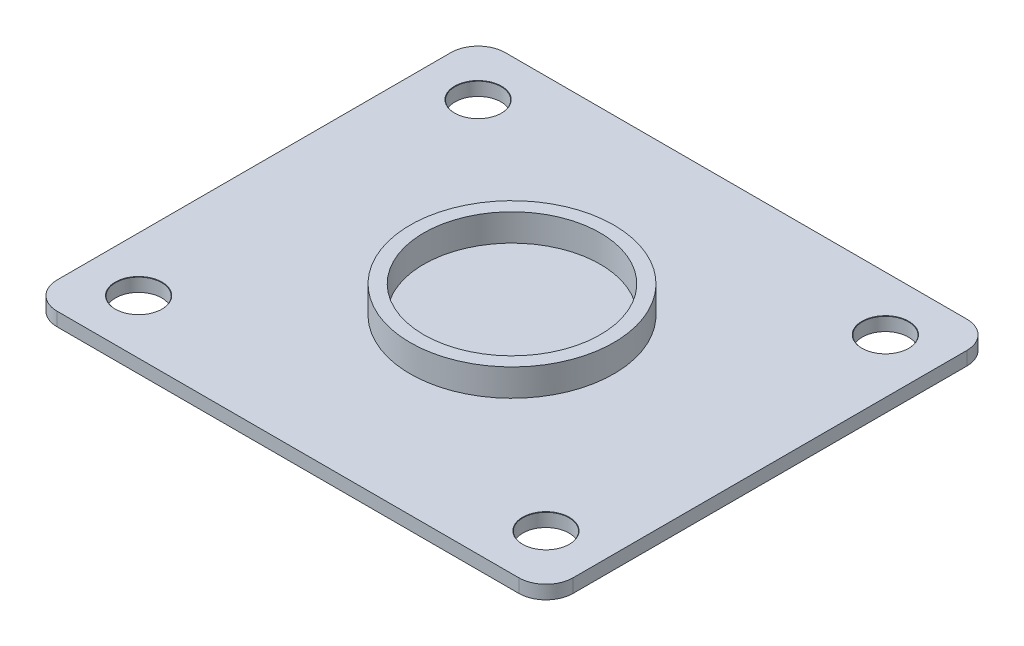
ISO-10303-21;
HEADER;
FILE_DESCRIPTION(('STEP AP214'),'2;1');
FILE_NAME('part.step','',(''),(''),'','','');
FILE_SCHEMA(('AUTOMOTIVE_DESIGN { 1 0 10303 214 1 1 1 1 }'));
ENDSEC;
DATA;
#1=APPLICATION_CONTEXT('core data for automotive mechanical design processes');
#2=APPLICATION_PROTOCOL_DEFINITION('international standard','automotive_design',2000,#1);
#3=PRODUCT_CONTEXT('',#1,'mechanical');
#4=PRODUCT('Part','Part','',(#3));
#5=PRODUCT_RELATED_PRODUCT_CATEGORY('part','',(#4));
#6=PRODUCT_DEFINITION_FORMATION('','',#4);
#7=PRODUCT_DEFINITION_CONTEXT('part definition',#1,'design');
#8=PRODUCT_DEFINITION('design','',#6,#7);
#9=PRODUCT_DEFINITION_SHAPE('','',#8);
#10=(LENGTH_UNIT() NAMED_UNIT(*) SI_UNIT(.MILLI.,.METRE.));
#11=(NAMED_UNIT(*) PLANE_ANGLE_UNIT() SI_UNIT($,.RADIAN.));
#12=(NAMED_UNIT(*) SI_UNIT($,.STERADIAN.) SOLID_ANGLE_UNIT());
#13=UNCERTAINTY_MEASURE_WITH_UNIT(LENGTH_MEASURE(1.E-05),#10,'distance_accuracy_value','');
#14=(GEOMETRIC_REPRESENTATION_CONTEXT(3) GLOBAL_UNCERTAINTY_ASSIGNED_CONTEXT((#13)) GLOBAL_UNIT_ASSIGNED_CONTEXT((#10,
#11,#12)) REPRESENTATION_CONTEXT('',''));
#15=CARTESIAN_POINT('',(0.,0.,0.));
#16=DIRECTION('',(0.,0.,1.));
#17=DIRECTION('',(1.,0.,0.));
#18=AXIS2_PLACEMENT_3D('',#15,#16,#17);
#19=CARTESIAN_POINT('',(0.,1.,0.));
#20=DIRECTION('',(1.,0.,0.));
#21=DIRECTION('',(0.,0.,-1.));
#22=AXIS2_PLACEMENT_3D('',#19,#20,#21);
#23=PLANE('',#22);
#24=DIRECTION('',(0.,0.,1.));
#25=VECTOR('',#24,1.);
#26=CARTESIAN_POINT('',(0.,1.,0.));
#27=LINE('',#26,#25);
#28=CARTESIAN_POINT('',(0.,1.,-31.));
#29=VERTEX_POINT('',#28);
#30=CARTESIAN_POINT('',(0.,1.,-2.));
#31=VERTEX_POINT('',#30);
#32=EDGE_CURVE('E126',#29,#31,#27,.T.);
#33=ORIENTED_EDGE('',*,*,#32,.F.);
#34=DIRECTION('',(0.,-1.,0.));
#35=VECTOR('',#34,1.);
#36=CARTESIAN_POINT('',(0.,1.,-31.));
#37=LINE('',#36,#35);
#38=CARTESIAN_POINT('',(0.,0.,-31.));
#39=VERTEX_POINT('',#38);
#40=EDGE_CURVE('E111',#29,#39,#37,.T.);
#41=ORIENTED_EDGE('',*,*,#40,.T.);
#42=DIRECTION('',(0.,0.,1.));
#43=VECTOR('',#42,1.);
#44=CARTESIAN_POINT('',(0.,0.,0.));
#45=LINE('',#44,#43);
#46=CARTESIAN_POINT('',(0.,0.,-2.));
#47=VERTEX_POINT('',#46);
#48=EDGE_CURVE('E123',#39,#47,#45,.T.);
#49=ORIENTED_EDGE('',*,*,#48,.T.);
#50=DIRECTION('',(0.,-1.,0.));
#51=VECTOR('',#50,1.);
#52=CARTESIAN_POINT('',(0.,1.,-2.));
#53=LINE('',#52,#51);
#54=EDGE_CURVE('E128',#47,#31,#53,.F.);
#55=ORIENTED_EDGE('',*,*,#54,.T.);
#56=EDGE_LOOP('',(#33,#41,#49,#55));
#57=FACE_BOUND('',#56,.T.);
#58=ADVANCED_FACE('F41',(#57),#23,.F.);
#59=CARTESIAN_POINT('',(0.,1.,0.));
#60=DIRECTION('',(0.,0.,-1.));
#61=DIRECTION('',(-1.,0.,0.));
#62=AXIS2_PLACEMENT_3D('',#59,#60,#61);
#63=PLANE('',#62);
#64=DIRECTION('',(1.,0.,0.));
#65=VECTOR('',#64,1.);
#66=CARTESIAN_POINT('',(0.,0.,0.));
#67=LINE('',#66,#65);
#68=CARTESIAN_POINT('',(2.,0.,0.));
#69=VERTEX_POINT('',#68);
#70=CARTESIAN_POINT('',(36.,0.,0.));
#71=VERTEX_POINT('',#70);
#72=EDGE_CURVE('E132',#69,#71,#67,.T.);
#73=ORIENTED_EDGE('',*,*,#72,.T.);
#74=DIRECTION('',(0.,-1.,0.));
#75=VECTOR('',#74,1.);
#76=CARTESIAN_POINT('',(36.,1.,0.));
#77=LINE('',#76,#75);
#78=CARTESIAN_POINT('',(36.,1.,0.));
#79=VERTEX_POINT('',#78);
#80=EDGE_CURVE('E11',#71,#79,#77,.F.);
#81=ORIENTED_EDGE('',*,*,#80,.T.);
#82=DIRECTION('',(1.,0.,0.));
#83=VECTOR('',#82,1.);
#84=CARTESIAN_POINT('',(0.,1.,0.));
#85=LINE('',#84,#83);
#86=CARTESIAN_POINT('',(2.,1.,0.));
#87=VERTEX_POINT('',#86);
#88=EDGE_CURVE('E175',#87,#79,#85,.T.);
#89=ORIENTED_EDGE('',*,*,#88,.F.);
#90=DIRECTION('',(0.,-1.,0.));
#91=VECTOR('',#90,1.);
#92=CARTESIAN_POINT('',(2.,1.,0.));
#93=LINE('',#92,#91);
#94=EDGE_CURVE('E49',#87,#69,#93,.T.);
#95=ORIENTED_EDGE('',*,*,#94,.T.);
#96=EDGE_LOOP('',(#73,#81,#89,#95));
#97=FACE_BOUND('',#96,.T.);
#98=ADVANCED_FACE('F173',(#97),#63,.F.);
#99=CARTESIAN_POINT('',(38.,1.,0.));
#100=DIRECTION('',(-1.,0.,0.));
#101=DIRECTION('',(0.,0.,1.));
#102=AXIS2_PLACEMENT_3D('',#99,#100,#101);
#103=PLANE('',#102);
#104=DIRECTION('',(0.,0.,-1.));
#105=VECTOR('',#104,1.);
#106=CARTESIAN_POINT('',(38.,0.,0.));
#107=LINE('',#106,#105);
#108=CARTESIAN_POINT('',(38.,0.,-2.));
#109=VERTEX_POINT('',#108);
#110=CARTESIAN_POINT('',(38.,0.,-31.));
#111=VERTEX_POINT('',#110);
#112=EDGE_CURVE('E136',#109,#111,#107,.T.);
#113=ORIENTED_EDGE('',*,*,#112,.T.);
#114=DIRECTION('',(0.,-1.,0.));
#115=VECTOR('',#114,1.);
#116=CARTESIAN_POINT('',(38.,1.,-31.));
#117=LINE('',#116,#115);
#118=CARTESIAN_POINT('',(38.,1.,-31.));
#119=VERTEX_POINT('',#118);
#120=EDGE_CURVE('E56',#111,#119,#117,.F.);
#121=ORIENTED_EDGE('',*,*,#120,.T.);
#122=DIRECTION('',(0.,0.,-1.));
#123=VECTOR('',#122,1.);
#124=CARTESIAN_POINT('',(38.,1.,0.));
#125=LINE('',#124,#123);
#126=CARTESIAN_POINT('',(38.,1.,-2.));
#127=VERTEX_POINT('',#126);
#128=EDGE_CURVE('E183',#127,#119,#125,.T.);
#129=ORIENTED_EDGE('',*,*,#128,.F.);
#130=DIRECTION('',(0.,-1.,0.));
#131=VECTOR('',#130,1.);
#132=CARTESIAN_POINT('',(38.,1.,-2.));
#133=LINE('',#132,#131);
#134=EDGE_CURVE('E166',#127,#109,#133,.T.);
#135=ORIENTED_EDGE('',*,*,#134,.T.);
#136=EDGE_LOOP('',(#113,#121,#129,#135));
#137=FACE_BOUND('',#136,.T.);
#138=ADVANCED_FACE('F182',(#137),#103,.F.);
#139=CARTESIAN_POINT('',(0.,1.,-33.));
#140=DIRECTION('',(0.,0.,1.));
#141=DIRECTION('',(1.,0.,0.));
#142=AXIS2_PLACEMENT_3D('',#139,#140,#141);
#143=PLANE('',#142);
#144=DIRECTION('',(-1.,0.,0.));
#145=VECTOR('',#144,1.);
#146=CARTESIAN_POINT('',(0.,0.,-33.));
#147=LINE('',#146,#145);
#148=CARTESIAN_POINT('',(36.,0.,-33.));
#149=VERTEX_POINT('',#148);
#150=CARTESIAN_POINT('',(2.,0.,-33.));
#151=VERTEX_POINT('',#150);
#152=EDGE_CURVE('E146',#149,#151,#147,.T.);
#153=ORIENTED_EDGE('',*,*,#152,.T.);
#154=DIRECTION('',(0.,-1.,0.));
#155=VECTOR('',#154,1.);
#156=CARTESIAN_POINT('',(2.,1.,-33.));
#157=LINE('',#156,#155);
#158=CARTESIAN_POINT('',(2.,1.,-33.));
#159=VERTEX_POINT('',#158);
#160=EDGE_CURVE('E112',#151,#159,#157,.F.);
#161=ORIENTED_EDGE('',*,*,#160,.T.);
#162=DIRECTION('',(-1.,0.,0.));
#163=VECTOR('',#162,1.);
#164=CARTESIAN_POINT('',(0.,1.,-33.));
#165=LINE('',#164,#163);
#166=CARTESIAN_POINT('',(36.,1.,-33.));
#167=VERTEX_POINT('',#166);
#168=EDGE_CURVE('E142',#167,#159,#165,.T.);
#169=ORIENTED_EDGE('',*,*,#168,.F.);
#170=DIRECTION('',(0.,-1.,0.));
#171=VECTOR('',#170,1.);
#172=CARTESIAN_POINT('',(36.,1.,-33.));
#173=LINE('',#172,#171);
#174=EDGE_CURVE('E117',#167,#149,#173,.T.);
#175=ORIENTED_EDGE('',*,*,#174,.T.);
#176=EDGE_LOOP('',(#153,#161,#169,#175));
#177=FACE_BOUND('',#176,.T.);
#178=ADVANCED_FACE('F236',(#177),#143,.F.);
#179=CARTESIAN_POINT('',(0.,1.,0.));
#180=DIRECTION('',(0.,-1.,0.));
#181=DIRECTION('',(0.,0.,-1.));
#182=AXIS2_PLACEMENT_3D('',#179,#180,#181);
#183=PLANE('',#182);
#184=CARTESIAN_POINT('',(4.,1.,-4.));
#185=DIRECTION('',(0.,1.,0.));
#186=DIRECTION('',(0.,0.,1.));
#187=AXIS2_PLACEMENT_3D('',#184,#185,#186);
#188=CIRCLE('',#187,1.725);
#189=CARTESIAN_POINT('',(4.,1.,-2.275));
#190=VERTEX_POINT('',#189);
#191=EDGE_CURVE('E227',#190,#190,#188,.T.);
#192=ORIENTED_EDGE('',*,*,#191,.F.);
#193=EDGE_LOOP('',(#192));
#194=FACE_BOUND('',#193,.T.);
#195=CARTESIAN_POINT('',(4.,1.,-29.));
#196=DIRECTION('',(0.,1.,0.));
#197=DIRECTION('',(0.,0.,1.));
#198=AXIS2_PLACEMENT_3D('',#195,#196,#197);
#199=CIRCLE('',#198,1.725);
#200=CARTESIAN_POINT('',(4.,1.,-27.275));
#201=VERTEX_POINT('',#200);
#202=EDGE_CURVE('E218',#201,#201,#199,.T.);
#203=ORIENTED_EDGE('',*,*,#202,.F.);
#204=EDGE_LOOP('',(#203));
#205=FACE_BOUND('',#204,.T.);
#206=CARTESIAN_POINT('',(34.,1.,-29.));
#207=DIRECTION('',(0.,1.,0.));
#208=DIRECTION('',(0.,0.,1.));
#209=AXIS2_PLACEMENT_3D('',#206,#207,#208);
#210=CIRCLE('',#209,1.725);
#211=CARTESIAN_POINT('',(34.,1.,-27.275));
#212=VERTEX_POINT('',#211);
#213=EDGE_CURVE('E209',#212,#212,#210,.T.);
#214=ORIENTED_EDGE('',*,*,#213,.F.);
#215=EDGE_LOOP('',(#214));
#216=FACE_BOUND('',#215,.T.);
#217=CARTESIAN_POINT('',(34.,1.,-4.00000000000001));
#218=DIRECTION('',(0.,1.,0.));
#219=DIRECTION('',(0.,0.,1.));
#220=AXIS2_PLACEMENT_3D('',#217,#218,#219);
#221=CIRCLE('',#220,1.725);
#222=CARTESIAN_POINT('',(34.,1.,-2.27500000000002));
#223=VERTEX_POINT('',#222);
#224=EDGE_CURVE('E200',#223,#223,#221,.T.);
#225=ORIENTED_EDGE('',*,*,#224,.F.);
#226=EDGE_LOOP('',(#225));
#227=FACE_BOUND('',#226,.T.);
#228=CARTESIAN_POINT('',(19.,1.,-16.5));
#229=DIRECTION('',(0.,-1.,0.));
#230=DIRECTION('',(0.,0.,-1.));
#231=AXIS2_PLACEMENT_3D('',#228,#229,#230);
#232=CIRCLE('',#231,7.5);
#233=CARTESIAN_POINT('',(19.,1.,-24.));
#234=VERTEX_POINT('',#233);
#235=EDGE_CURVE('E148',#234,#234,#232,.F.);
#236=ORIENTED_EDGE('',*,*,#235,.F.);
#237=EDGE_LOOP('',(#236));
#238=FACE_BOUND('',#237,.T.);
#239=ORIENTED_EDGE('',*,*,#168,.T.);
#240=CARTESIAN_POINT('',(2.,1.,-31.));
#241=DIRECTION('',(0.,-1.,0.));
#242=DIRECTION('',(0.,0.,-1.));
#243=AXIS2_PLACEMENT_3D('',#240,#241,#242);
#244=CIRCLE('',#243,2.);
#245=EDGE_CURVE('E164',#159,#29,#244,.F.);
#246=ORIENTED_EDGE('',*,*,#245,.T.);
#247=ORIENTED_EDGE('',*,*,#32,.T.);
#248=CARTESIAN_POINT('',(2.,1.,-2.));
#249=DIRECTION('',(0.,-1.,0.));
#250=DIRECTION('',(0.,0.,-1.));
#251=AXIS2_PLACEMENT_3D('',#248,#249,#250);
#252=CIRCLE('',#251,2.);
#253=EDGE_CURVE('E159',#31,#87,#252,.F.);
#254=ORIENTED_EDGE('',*,*,#253,.T.);
#255=ORIENTED_EDGE('',*,*,#88,.T.);
#256=CARTESIAN_POINT('',(36.,1.,-2.));
#257=DIRECTION('',(0.,-1.,0.));
#258=DIRECTION('',(0.,0.,-1.));
#259=AXIS2_PLACEMENT_3D('',#256,#257,#258);
#260=CIRCLE('',#259,2.);
#261=EDGE_CURVE('E63',#79,#127,#260,.F.);
#262=ORIENTED_EDGE('',*,*,#261,.T.);
#263=ORIENTED_EDGE('',*,*,#128,.T.);
#264=CARTESIAN_POINT('',(36.,1.,-31.));
#265=DIRECTION('',(0.,-1.,0.));
#266=DIRECTION('',(0.,0.,-1.));
#267=AXIS2_PLACEMENT_3D('',#264,#265,#266);
#268=CIRCLE('',#267,2.);
#269=EDGE_CURVE('E162',#119,#167,#268,.F.);
#270=ORIENTED_EDGE('',*,*,#269,.T.);
#271=EDGE_LOOP('',(#239,#246,#247,#254,#255,#262,#263,#270));
#272=FACE_BOUND('',#271,.T.);
#273=ADVANCED_FACE('F233',(#194,#205,#216,#227,#238,#272),#183,.F.);
#274=CARTESIAN_POINT('',(0.,0.,0.));
#275=DIRECTION('',(0.,-1.,0.));
#276=DIRECTION('',(0.,0.,-1.));
#277=AXIS2_PLACEMENT_3D('',#274,#275,#276);
#278=PLANE('',#277);
#279=CARTESIAN_POINT('',(4.,0.,-4.));
#280=DIRECTION('',(0.,1.,0.));
#281=DIRECTION('',(0.,0.,1.));
#282=AXIS2_PLACEMENT_3D('',#279,#280,#281);
#283=CIRCLE('',#282,1.7);
#284=CARTESIAN_POINT('',(4.,0.,-2.3));
#285=VERTEX_POINT('',#284);
#286=EDGE_CURVE('E221',#285,#285,#283,.T.);
#287=ORIENTED_EDGE('',*,*,#286,.T.);
#288=EDGE_LOOP('',(#287));
#289=FACE_BOUND('',#288,.T.);
#290=CARTESIAN_POINT('',(4.,0.,-29.));
#291=DIRECTION('',(0.,1.,0.));
#292=DIRECTION('',(0.,0.,1.));
#293=AXIS2_PLACEMENT_3D('',#290,#291,#292);
#294=CIRCLE('',#293,1.7);
#295=CARTESIAN_POINT('',(4.,0.,-27.3));
#296=VERTEX_POINT('',#295);
#297=EDGE_CURVE('E212',#296,#296,#294,.T.);
#298=ORIENTED_EDGE('',*,*,#297,.T.);
#299=EDGE_LOOP('',(#298));
#300=FACE_BOUND('',#299,.T.);
#301=CARTESIAN_POINT('',(34.,0.,-29.));
#302=DIRECTION('',(0.,1.,0.));
#303=DIRECTION('',(0.,0.,1.));
#304=AXIS2_PLACEMENT_3D('',#301,#302,#303);
#305=CIRCLE('',#304,1.7);
#306=CARTESIAN_POINT('',(34.,0.,-27.3));
#307=VERTEX_POINT('',#306);
#308=EDGE_CURVE('E203',#307,#307,#305,.T.);
#309=ORIENTED_EDGE('',*,*,#308,.T.);
#310=EDGE_LOOP('',(#309));
#311=FACE_BOUND('',#310,.T.);
#312=CARTESIAN_POINT('',(34.,0.,-4.00000000000001));
#313=DIRECTION('',(0.,1.,0.));
#314=DIRECTION('',(0.,0.,1.));
#315=AXIS2_PLACEMENT_3D('',#312,#313,#314);
#316=CIRCLE('',#315,1.7);
#317=CARTESIAN_POINT('',(34.,0.,-2.30000000000001));
#318=VERTEX_POINT('',#317);
#319=EDGE_CURVE('E192',#318,#318,#316,.T.);
#320=ORIENTED_EDGE('',*,*,#319,.T.);
#321=EDGE_LOOP('',(#320));
#322=FACE_BOUND('',#321,.T.);
#323=ORIENTED_EDGE('',*,*,#48,.F.);
#324=CARTESIAN_POINT('',(2.,0.,-31.));
#325=DIRECTION('',(0.,-1.,0.));
#326=DIRECTION('',(0.,0.,-1.));
#327=AXIS2_PLACEMENT_3D('',#324,#325,#326);
#328=CIRCLE('',#327,2.);
#329=EDGE_CURVE('E107',#39,#151,#328,.T.);
#330=ORIENTED_EDGE('',*,*,#329,.T.);
#331=ORIENTED_EDGE('',*,*,#152,.F.);
#332=CARTESIAN_POINT('',(36.,0.,-31.));
#333=DIRECTION('',(0.,-1.,0.));
#334=DIRECTION('',(0.,0.,-1.));
#335=AXIS2_PLACEMENT_3D('',#332,#333,#334);
#336=CIRCLE('',#335,2.);
#337=EDGE_CURVE('E118',#149,#111,#336,.T.);
#338=ORIENTED_EDGE('',*,*,#337,.T.);
#339=ORIENTED_EDGE('',*,*,#112,.F.);
#340=CARTESIAN_POINT('',(36.,0.,-2.));
#341=DIRECTION('',(0.,-1.,0.));
#342=DIRECTION('',(0.,0.,-1.));
#343=AXIS2_PLACEMENT_3D('',#340,#341,#342);
#344=CIRCLE('',#343,2.);
#345=EDGE_CURVE('E153',#109,#71,#344,.T.);
#346=ORIENTED_EDGE('',*,*,#345,.T.);
#347=ORIENTED_EDGE('',*,*,#72,.F.);
#348=CARTESIAN_POINT('',(2.,0.,-2.));
#349=DIRECTION('',(0.,-1.,0.));
#350=DIRECTION('',(0.,0.,-1.));
#351=AXIS2_PLACEMENT_3D('',#348,#349,#350);
#352=CIRCLE('',#351,2.);
#353=EDGE_CURVE('E127',#69,#47,#352,.T.);
#354=ORIENTED_EDGE('',*,*,#353,.T.);
#355=EDGE_LOOP('',(#323,#330,#331,#338,#339,#346,#347,#354));
#356=FACE_BOUND('',#355,.T.);
#357=ADVANCED_FACE('F130',(#289,#300,#311,#322,#356),#278,.T.);
#358=CARTESIAN_POINT('',(19.,3.,-16.5));
#359=DIRECTION('',(0.,1.,0.));
#360=DIRECTION('',(0.,0.,1.));
#361=AXIS2_PLACEMENT_3D('',#358,#359,#360);
#362=PLANE('',#361);
#363=CARTESIAN_POINT('',(19.,3.,-16.5));
#364=DIRECTION('',(0.,1.,0.));
#365=DIRECTION('',(0.,0.,1.));
#366=AXIS2_PLACEMENT_3D('',#363,#364,#365);
#367=CIRCLE('',#366,7.5);
#368=CARTESIAN_POINT('',(19.,3.,-9.));
#369=VERTEX_POINT('',#368);
#370=EDGE_CURVE('E133',#369,#369,#367,.T.);
#371=ORIENTED_EDGE('',*,*,#370,.T.);
#372=EDGE_LOOP('',(#371));
#373=FACE_BOUND('',#372,.T.);
#374=CARTESIAN_POINT('',(19.,3.,-16.5));
#375=DIRECTION('',(0.,1.,0.));
#376=DIRECTION('',(0.,0.,1.));
#377=AXIS2_PLACEMENT_3D('',#374,#375,#376);
#378=CIRCLE('',#377,6.50000000000001);
#379=CARTESIAN_POINT('',(19.,3.,-9.99999999999999));
#380=VERTEX_POINT('',#379);
#381=EDGE_CURVE('E139',#380,#380,#378,.T.);
#382=ORIENTED_EDGE('',*,*,#381,.F.);
#383=EDGE_LOOP('',(#382));
#384=FACE_BOUND('',#383,.T.);
#385=ADVANCED_FACE('F271',(#373,#384),#362,.T.);
#386=CARTESIAN_POINT('',(19.,3.,-16.5));
#387=DIRECTION('',(0.,-1.,0.));
#388=DIRECTION('',(0.,0.,-1.));
#389=AXIS2_PLACEMENT_3D('',#386,#387,#388);
#390=CYLINDRICAL_SURFACE('',#389,7.5);
#391=ORIENTED_EDGE('',*,*,#370,.F.);
#392=EDGE_LOOP('',(#391));
#393=FACE_BOUND('',#392,.T.);
#394=ORIENTED_EDGE('',*,*,#235,.T.);
#395=EDGE_LOOP('',(#394));
#396=FACE_BOUND('',#395,.T.);
#397=ADVANCED_FACE('F274',(#393,#396),#390,.T.);
#398=CARTESIAN_POINT('',(19.,3.,-16.5));
#399=DIRECTION('',(0.,-1.,0.));
#400=DIRECTION('',(0.,0.,-1.));
#401=AXIS2_PLACEMENT_3D('',#398,#399,#400);
#402=CYLINDRICAL_SURFACE('',#401,6.50000000000001);
#403=ORIENTED_EDGE('',*,*,#381,.T.);
#404=EDGE_LOOP('',(#403));
#405=FACE_BOUND('',#404,.T.);
#406=CARTESIAN_POINT('',(19.,1.,-16.5));
#407=DIRECTION('',(0.,1.,0.));
#408=DIRECTION('',(0.,0.,1.));
#409=AXIS2_PLACEMENT_3D('',#406,#407,#408);
#410=CIRCLE('',#409,6.50000000000001);
#411=CARTESIAN_POINT('',(19.,1.,-9.99999999999999));
#412=VERTEX_POINT('',#411);
#413=EDGE_CURVE('E189',#412,#412,#410,.T.);
#414=ORIENTED_EDGE('',*,*,#413,.F.);
#415=EDGE_LOOP('',(#414));
#416=FACE_BOUND('',#415,.T.);
#417=ADVANCED_FACE('F277',(#405,#416),#402,.F.);
#418=ORIENTED_EDGE('',*,*,#413,.T.);
#419=EDGE_LOOP('',(#418));
#420=FACE_BOUND('',#419,.T.);
#421=ADVANCED_FACE('F238',(#420),#183,.F.);
#422=CARTESIAN_POINT('',(34.,1.,-4.00000000000001));
#423=DIRECTION('',(0.,1.,0.));
#424=DIRECTION('',(0.,0.,1.));
#425=AXIS2_PLACEMENT_3D('',#422,#423,#424);
#426=CYLINDRICAL_SURFACE('',#425,1.7);
#427=ORIENTED_EDGE('',*,*,#319,.F.);
#428=EDGE_LOOP('',(#427));
#429=FACE_BOUND('',#428,.T.);
#430=CARTESIAN_POINT('',(34.,0.974999999999999,-4.00000000000001));
#431=DIRECTION('',(0.,1.,0.));
#432=DIRECTION('',(0.,0.,1.));
#433=AXIS2_PLACEMENT_3D('',#430,#431,#432);
#434=CIRCLE('',#433,1.7);
#435=CARTESIAN_POINT('',(34.,0.974999999999999,-2.30000000000001));
#436=VERTEX_POINT('',#435);
#437=EDGE_CURVE('E197',#436,#436,#434,.T.);
#438=ORIENTED_EDGE('',*,*,#437,.T.);
#439=EDGE_LOOP('',(#438));
#440=FACE_BOUND('',#439,.T.);
#441=ADVANCED_FACE('F285',(#429,#440),#426,.F.);
#442=CARTESIAN_POINT('',(34.,1.,-4.00000000000001));
#443=DIRECTION('',(0.,1.,0.));
#444=DIRECTION('',(0.,0.,1.));
#445=AXIS2_PLACEMENT_3D('',#442,#443,#444);
#446=CONICAL_SURFACE('',#445,1.725,0.785398163397372);
#447=ORIENTED_EDGE('',*,*,#437,.F.);
#448=EDGE_LOOP('',(#447));
#449=FACE_BOUND('',#448,.T.);
#450=ORIENTED_EDGE('',*,*,#224,.T.);
#451=EDGE_LOOP('',(#450));
#452=FACE_BOUND('',#451,.T.);
#453=ADVANCED_FACE('F288',(#449,#452),#446,.F.);
#454=CARTESIAN_POINT('',(34.,1.,-29.));
#455=DIRECTION('',(0.,1.,0.));
#456=DIRECTION('',(0.,0.,1.));
#457=AXIS2_PLACEMENT_3D('',#454,#455,#456);
#458=CYLINDRICAL_SURFACE('',#457,1.7);
#459=ORIENTED_EDGE('',*,*,#308,.F.);
#460=EDGE_LOOP('',(#459));
#461=FACE_BOUND('',#460,.T.);
#462=CARTESIAN_POINT('',(34.,0.974999999999999,-29.));
#463=DIRECTION('',(0.,1.,0.));
#464=DIRECTION('',(0.,0.,1.));
#465=AXIS2_PLACEMENT_3D('',#462,#463,#464);
#466=CIRCLE('',#465,1.7);
#467=CARTESIAN_POINT('',(34.,0.974999999999999,-27.3));
#468=VERTEX_POINT('',#467);
#469=EDGE_CURVE('E206',#468,#468,#466,.T.);
#470=ORIENTED_EDGE('',*,*,#469,.T.);
#471=EDGE_LOOP('',(#470));
#472=FACE_BOUND('',#471,.T.);
#473=ADVANCED_FACE('F292',(#461,#472),#458,.F.);
#474=CARTESIAN_POINT('',(34.,1.,-29.));
#475=DIRECTION('',(0.,1.,0.));
#476=DIRECTION('',(0.,0.,1.));
#477=AXIS2_PLACEMENT_3D('',#474,#475,#476);
#478=CONICAL_SURFACE('',#477,1.725,0.785398163397372);
#479=ORIENTED_EDGE('',*,*,#469,.F.);
#480=EDGE_LOOP('',(#479));
#481=FACE_BOUND('',#480,.T.);
#482=ORIENTED_EDGE('',*,*,#213,.T.);
#483=EDGE_LOOP('',(#482));
#484=FACE_BOUND('',#483,.T.);
#485=ADVANCED_FACE('F296',(#481,#484),#478,.F.);
#486=CARTESIAN_POINT('',(4.,1.,-29.));
#487=DIRECTION('',(0.,1.,0.));
#488=DIRECTION('',(0.,0.,1.));
#489=AXIS2_PLACEMENT_3D('',#486,#487,#488);
#490=CYLINDRICAL_SURFACE('',#489,1.7);
#491=ORIENTED_EDGE('',*,*,#297,.F.);
#492=EDGE_LOOP('',(#491));
#493=FACE_BOUND('',#492,.T.);
#494=CARTESIAN_POINT('',(4.,0.974999999999999,-29.));
#495=DIRECTION('',(0.,1.,0.));
#496=DIRECTION('',(0.,0.,1.));
#497=AXIS2_PLACEMENT_3D('',#494,#495,#496);
#498=CIRCLE('',#497,1.7);
#499=CARTESIAN_POINT('',(4.,0.974999999999999,-27.3));
#500=VERTEX_POINT('',#499);
#501=EDGE_CURVE('E215',#500,#500,#498,.T.);
#502=ORIENTED_EDGE('',*,*,#501,.T.);
#503=EDGE_LOOP('',(#502));
#504=FACE_BOUND('',#503,.T.);
#505=ADVANCED_FACE('F300',(#493,#504),#490,.F.);
#506=CARTESIAN_POINT('',(4.,1.,-29.));
#507=DIRECTION('',(0.,1.,0.));
#508=DIRECTION('',(0.,0.,1.));
#509=AXIS2_PLACEMENT_3D('',#506,#507,#508);
#510=CONICAL_SURFACE('',#509,1.725,0.785398163397424);
#511=ORIENTED_EDGE('',*,*,#501,.F.);
#512=EDGE_LOOP('',(#511));
#513=FACE_BOUND('',#512,.T.);
#514=ORIENTED_EDGE('',*,*,#202,.T.);
#515=EDGE_LOOP('',(#514));
#516=FACE_BOUND('',#515,.T.);
#517=ADVANCED_FACE('F304',(#513,#516),#510,.F.);
#518=CARTESIAN_POINT('',(4.,1.,-4.));
#519=DIRECTION('',(0.,1.,0.));
#520=DIRECTION('',(0.,0.,1.));
#521=AXIS2_PLACEMENT_3D('',#518,#519,#520);
#522=CYLINDRICAL_SURFACE('',#521,1.7);
#523=ORIENTED_EDGE('',*,*,#286,.F.);
#524=EDGE_LOOP('',(#523));
#525=FACE_BOUND('',#524,.T.);
#526=CARTESIAN_POINT('',(4.,0.974999999999999,-4.));
#527=DIRECTION('',(0.,1.,0.));
#528=DIRECTION('',(0.,0.,1.));
#529=AXIS2_PLACEMENT_3D('',#526,#527,#528);
#530=CIRCLE('',#529,1.7);
#531=CARTESIAN_POINT('',(4.,0.974999999999999,-2.3));
#532=VERTEX_POINT('',#531);
#533=EDGE_CURVE('E224',#532,#532,#530,.T.);
#534=ORIENTED_EDGE('',*,*,#533,.T.);
#535=EDGE_LOOP('',(#534));
#536=FACE_BOUND('',#535,.T.);
#537=ADVANCED_FACE('F308',(#525,#536),#522,.F.);
#538=CARTESIAN_POINT('',(4.,1.,-4.));
#539=DIRECTION('',(0.,1.,0.));
#540=DIRECTION('',(0.,0.,1.));
#541=AXIS2_PLACEMENT_3D('',#538,#539,#540);
#542=CONICAL_SURFACE('',#541,1.725,0.785398163397424);
#543=ORIENTED_EDGE('',*,*,#533,.F.);
#544=EDGE_LOOP('',(#543));
#545=FACE_BOUND('',#544,.T.);
#546=ORIENTED_EDGE('',*,*,#191,.T.);
#547=EDGE_LOOP('',(#546));
#548=FACE_BOUND('',#547,.T.);
#549=ADVANCED_FACE('F231',(#545,#548),#542,.F.);
#550=CARTESIAN_POINT('',(2.,1.,-31.));
#551=DIRECTION('',(0.,-1.,0.));
#552=DIRECTION('',(0.,0.,-1.));
#553=AXIS2_PLACEMENT_3D('',#550,#551,#552);
#554=CYLINDRICAL_SURFACE('',#553,2.);
#555=ORIENTED_EDGE('',*,*,#245,.F.);
#556=ORIENTED_EDGE('',*,*,#160,.F.);
#557=ORIENTED_EDGE('',*,*,#329,.F.);
#558=ORIENTED_EDGE('',*,*,#40,.F.);
#559=EDGE_LOOP('',(#555,#556,#557,#558));
#560=FACE_BOUND('',#559,.T.);
#561=ADVANCED_FACE('F110',(#560),#554,.T.);
#562=CARTESIAN_POINT('',(36.,1.,-31.));
#563=DIRECTION('',(0.,-1.,0.));
#564=DIRECTION('',(0.,0.,-1.));
#565=AXIS2_PLACEMENT_3D('',#562,#563,#564);
#566=CYLINDRICAL_SURFACE('',#565,2.);
#567=ORIENTED_EDGE('',*,*,#269,.F.);
#568=ORIENTED_EDGE('',*,*,#120,.F.);
#569=ORIENTED_EDGE('',*,*,#337,.F.);
#570=ORIENTED_EDGE('',*,*,#174,.F.);
#571=EDGE_LOOP('',(#567,#568,#569,#570));
#572=FACE_BOUND('',#571,.T.);
#573=ADVANCED_FACE('F250',(#572),#566,.T.);
#574=CARTESIAN_POINT('',(36.,1.,-2.));
#575=DIRECTION('',(0.,-1.,0.));
#576=DIRECTION('',(0.,0.,-1.));
#577=AXIS2_PLACEMENT_3D('',#574,#575,#576);
#578=CYLINDRICAL_SURFACE('',#577,2.);
#579=ORIENTED_EDGE('',*,*,#261,.F.);
#580=ORIENTED_EDGE('',*,*,#80,.F.);
#581=ORIENTED_EDGE('',*,*,#345,.F.);
#582=ORIENTED_EDGE('',*,*,#134,.F.);
#583=EDGE_LOOP('',(#579,#580,#581,#582));
#584=FACE_BOUND('',#583,.T.);
#585=ADVANCED_FACE('F181',(#584),#578,.T.);
#586=CARTESIAN_POINT('',(2.,1.,-2.));
#587=DIRECTION('',(0.,-1.,0.));
#588=DIRECTION('',(0.,0.,-1.));
#589=AXIS2_PLACEMENT_3D('',#586,#587,#588);
#590=CYLINDRICAL_SURFACE('',#589,2.);
#591=ORIENTED_EDGE('',*,*,#253,.F.);
#592=ORIENTED_EDGE('',*,*,#54,.F.);
#593=ORIENTED_EDGE('',*,*,#353,.F.);
#594=ORIENTED_EDGE('',*,*,#94,.F.);
#595=EDGE_LOOP('',(#591,#592,#593,#594));
#596=FACE_BOUND('',#595,.T.);
#597=ADVANCED_FACE('F43',(#596),#590,.T.);
#598=CLOSED_SHELL('',(#58,#98,#138,#178,#273,#357,#385,#397,#417,#421,#441,#453,#473,#485,#505,
#517,#537,#549,#561,#573,#585,#597));
#599=MANIFOLD_SOLID_BREP('B2',#598);
#600=ADVANCED_BREP_SHAPE_REPRESENTATION('',(#18,#599),#14);
#601=SHAPE_DEFINITION_REPRESENTATION(#9,#600);
ENDSEC;
END-ISO-10303-21;
